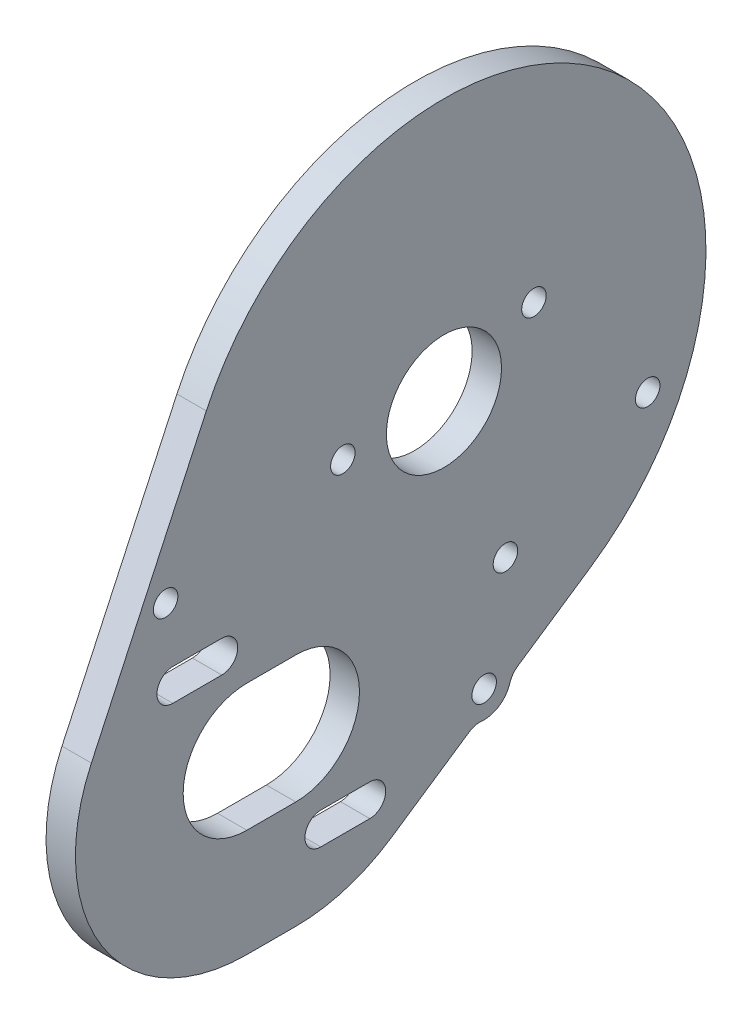
ISO-10303-21;
HEADER;
FILE_DESCRIPTION(('STEP AP214'),'2;1');
FILE_NAME('part.step','',(''),(''),'','','');
FILE_SCHEMA(('AUTOMOTIVE_DESIGN { 1 0 10303 214 1 1 1 1 }'));
ENDSEC;
DATA;
#1=APPLICATION_CONTEXT('core data for automotive mechanical design processes');
#2=APPLICATION_PROTOCOL_DEFINITION('international standard','automotive_design',2000,#1);
#3=PRODUCT_CONTEXT('',#1,'mechanical');
#4=PRODUCT('Part','Part','',(#3));
#5=PRODUCT_RELATED_PRODUCT_CATEGORY('part','',(#4));
#6=PRODUCT_DEFINITION_FORMATION('','',#4);
#7=PRODUCT_DEFINITION_CONTEXT('part definition',#1,'design');
#8=PRODUCT_DEFINITION('design','',#6,#7);
#9=PRODUCT_DEFINITION_SHAPE('','',#8);
#10=(LENGTH_UNIT() NAMED_UNIT(*) SI_UNIT(.MILLI.,.METRE.));
#11=(NAMED_UNIT(*) PLANE_ANGLE_UNIT() SI_UNIT($,.RADIAN.));
#12=(NAMED_UNIT(*) SI_UNIT($,.STERADIAN.) SOLID_ANGLE_UNIT());
#13=UNCERTAINTY_MEASURE_WITH_UNIT(LENGTH_MEASURE(1.E-05),#10,'distance_accuracy_value','');
#14=(GEOMETRIC_REPRESENTATION_CONTEXT(3) GLOBAL_UNCERTAINTY_ASSIGNED_CONTEXT((#13)) GLOBAL_UNIT_ASSIGNED_CONTEXT((#10,
#11,#12)) REPRESENTATION_CONTEXT('',''));
#15=CARTESIAN_POINT('',(0.,0.,0.));
#16=DIRECTION('',(0.,0.,1.));
#17=DIRECTION('',(1.,0.,0.));
#18=AXIS2_PLACEMENT_3D('',#15,#16,#17);
#19=CARTESIAN_POINT('',(3.,-11.25,22.6793840389092));
#20=DIRECTION('',(-1.,0.,0.));
#21=DIRECTION('',(0.,0.,1.));
#22=AXIS2_PLACEMENT_3D('',#19,#20,#21);
#23=CYLINDRICAL_SURFACE('',#22,1.625);
#24=CARTESIAN_POINT('',(0.,-11.25,22.6793840389092));
#25=DIRECTION('',(1.,0.,0.));
#26=DIRECTION('',(0.,0.,-1.));
#27=AXIS2_PLACEMENT_3D('',#24,#25,#26);
#28=CIRCLE('',#27,1.625);
#29=CARTESIAN_POINT('',(0.,-12.875,22.6793840389092));
#30=VERTEX_POINT('',#29);
#31=CARTESIAN_POINT('',(0.,-9.625,22.6793840389092));
#32=VERTEX_POINT('',#31);
#33=EDGE_CURVE('E285',#30,#32,#28,.T.);
#34=ORIENTED_EDGE('',*,*,#33,.F.);
#35=DIRECTION('',(-1.,0.,0.));
#36=VECTOR('',#35,1.);
#37=CARTESIAN_POINT('',(3.,-12.875,22.6793840389092));
#38=LINE('',#37,#36);
#39=CARTESIAN_POINT('',(3.,-12.875,22.6793840389092));
#40=VERTEX_POINT('',#39);
#41=EDGE_CURVE('E11',#40,#30,#38,.T.);
#42=ORIENTED_EDGE('',*,*,#41,.F.);
#43=CARTESIAN_POINT('',(3.,-11.25,22.6793840389092));
#44=DIRECTION('',(1.,0.,0.));
#45=DIRECTION('',(0.,0.,-1.));
#46=AXIS2_PLACEMENT_3D('',#43,#44,#45);
#47=CIRCLE('',#46,1.625);
#48=CARTESIAN_POINT('',(3.,-9.625,22.6793840389092));
#49=VERTEX_POINT('',#48);
#50=EDGE_CURVE('E207',#40,#49,#47,.T.);
#51=ORIENTED_EDGE('',*,*,#50,.T.);
#52=DIRECTION('',(-1.,0.,0.));
#53=VECTOR('',#52,1.);
#54=CARTESIAN_POINT('',(3.,-9.625,22.6793840389092));
#55=LINE('',#54,#53);
#56=EDGE_CURVE('E54',#49,#32,#55,.T.);
#57=ORIENTED_EDGE('',*,*,#56,.T.);
#58=EDGE_LOOP('',(#34,#42,#51,#57));
#59=FACE_BOUND('',#58,.T.);
#60=ADVANCED_FACE('F35',(#59),#23,.F.);
#61=CARTESIAN_POINT('',(3.,-12.875,0.));
#62=DIRECTION('',(0.,1.,0.));
#63=DIRECTION('',(0.,0.,1.));
#64=AXIS2_PLACEMENT_3D('',#61,#62,#63);
#65=PLANE('',#64);
#66=DIRECTION('',(0.,0.,-1.));
#67=VECTOR('',#66,1.);
#68=CARTESIAN_POINT('',(0.,-12.875,0.));
#69=LINE('',#68,#67);
#70=CARTESIAN_POINT('',(0.,-12.875,27.6793840389092));
#71=VERTEX_POINT('',#70);
#72=EDGE_CURVE('E195',#71,#30,#69,.T.);
#73=ORIENTED_EDGE('',*,*,#72,.F.);
#74=DIRECTION('',(-1.,0.,0.));
#75=VECTOR('',#74,1.);
#76=CARTESIAN_POINT('',(3.,-12.875,27.6793840389092));
#77=LINE('',#76,#75);
#78=CARTESIAN_POINT('',(3.,-12.875,27.6793840389092));
#79=VERTEX_POINT('',#78);
#80=EDGE_CURVE('E45',#79,#71,#77,.T.);
#81=ORIENTED_EDGE('',*,*,#80,.F.);
#82=DIRECTION('',(0.,0.,-1.));
#83=VECTOR('',#82,1.);
#84=CARTESIAN_POINT('',(3.,-12.875,0.));
#85=LINE('',#84,#83);
#86=EDGE_CURVE('E193',#79,#40,#85,.T.);
#87=ORIENTED_EDGE('',*,*,#86,.T.);
#88=ORIENTED_EDGE('',*,*,#41,.T.);
#89=EDGE_LOOP('',(#73,#81,#87,#88));
#90=FACE_BOUND('',#89,.T.);
#91=ADVANCED_FACE('F192',(#90),#65,.T.);
#92=CARTESIAN_POINT('',(3.,-11.25,27.6793840389092));
#93=DIRECTION('',(-1.,0.,0.));
#94=DIRECTION('',(0.,0.,1.));
#95=AXIS2_PLACEMENT_3D('',#92,#93,#94);
#96=CYLINDRICAL_SURFACE('',#95,1.625);
#97=CARTESIAN_POINT('',(0.,-11.25,27.6793840389092));
#98=DIRECTION('',(1.,0.,0.));
#99=DIRECTION('',(0.,0.,-1.));
#100=AXIS2_PLACEMENT_3D('',#97,#98,#99);
#101=CIRCLE('',#100,1.625);
#102=CARTESIAN_POINT('',(0.,-9.625,27.6793840389092));
#103=VERTEX_POINT('',#102);
#104=EDGE_CURVE('E288',#103,#71,#101,.T.);
#105=ORIENTED_EDGE('',*,*,#104,.F.);
#106=DIRECTION('',(-1.,0.,0.));
#107=VECTOR('',#106,1.);
#108=CARTESIAN_POINT('',(3.,-9.625,27.6793840389092));
#109=LINE('',#108,#107);
#110=CARTESIAN_POINT('',(3.,-9.625,27.6793840389092));
#111=VERTEX_POINT('',#110);
#112=EDGE_CURVE('E121',#111,#103,#109,.T.);
#113=ORIENTED_EDGE('',*,*,#112,.F.);
#114=CARTESIAN_POINT('',(3.,-11.25,27.6793840389092));
#115=DIRECTION('',(1.,0.,0.));
#116=DIRECTION('',(0.,0.,-1.));
#117=AXIS2_PLACEMENT_3D('',#114,#115,#116);
#118=CIRCLE('',#117,1.625);
#119=EDGE_CURVE('E206',#111,#79,#118,.T.);
#120=ORIENTED_EDGE('',*,*,#119,.T.);
#121=ORIENTED_EDGE('',*,*,#80,.T.);
#122=EDGE_LOOP('',(#105,#113,#120,#121));
#123=FACE_BOUND('',#122,.T.);
#124=ADVANCED_FACE('F209',(#123),#96,.F.);
#125=CARTESIAN_POINT('',(3.,-31.5,7.57061596109084));
#126=DIRECTION('',(-1.,0.,0.));
#127=DIRECTION('',(0.,0.,1.));
#128=AXIS2_PLACEMENT_3D('',#125,#126,#127);
#129=CYLINDRICAL_SURFACE('',#128,1.625);
#130=CARTESIAN_POINT('',(0.,-31.5,7.57061596109084));
#131=DIRECTION('',(1.,0.,0.));
#132=DIRECTION('',(0.,0.,-1.));
#133=AXIS2_PLACEMENT_3D('',#130,#131,#132);
#134=CIRCLE('',#133,1.625);
#135=CARTESIAN_POINT('',(0.,-33.125,7.57061596109084));
#136=VERTEX_POINT('',#135);
#137=CARTESIAN_POINT('',(0.,-29.875,7.57061596109084));
#138=VERTEX_POINT('',#137);
#139=EDGE_CURVE('E270',#136,#138,#134,.T.);
#140=ORIENTED_EDGE('',*,*,#139,.F.);
#141=DIRECTION('',(-1.,0.,0.));
#142=VECTOR('',#141,1.);
#143=CARTESIAN_POINT('',(3.,-33.125,7.57061596109084));
#144=LINE('',#143,#142);
#145=CARTESIAN_POINT('',(3.,-33.125,7.57061596109084));
#146=VERTEX_POINT('',#145);
#147=EDGE_CURVE('E310',#146,#136,#144,.T.);
#148=ORIENTED_EDGE('',*,*,#147,.F.);
#149=CARTESIAN_POINT('',(3.,-31.5,7.57061596109084));
#150=DIRECTION('',(1.,0.,0.));
#151=DIRECTION('',(0.,0.,-1.));
#152=AXIS2_PLACEMENT_3D('',#149,#150,#151);
#153=CIRCLE('',#152,1.625);
#154=CARTESIAN_POINT('',(3.,-29.875,7.57061596109084));
#155=VERTEX_POINT('',#154);
#156=EDGE_CURVE('E430',#146,#155,#153,.T.);
#157=ORIENTED_EDGE('',*,*,#156,.T.);
#158=DIRECTION('',(-1.,0.,0.));
#159=VECTOR('',#158,1.);
#160=CARTESIAN_POINT('',(3.,-29.875,7.57061596109084));
#161=LINE('',#160,#159);
#162=EDGE_CURVE('E312',#155,#138,#161,.T.);
#163=ORIENTED_EDGE('',*,*,#162,.T.);
#164=EDGE_LOOP('',(#140,#148,#157,#163));
#165=FACE_BOUND('',#164,.T.);
#166=ADVANCED_FACE('F479',(#165),#129,.F.);
#167=CARTESIAN_POINT('',(3.,-33.125,0.));
#168=DIRECTION('',(0.,1.,0.));
#169=DIRECTION('',(0.,0.,1.));
#170=AXIS2_PLACEMENT_3D('',#167,#168,#169);
#171=PLANE('',#170);
#172=DIRECTION('',(0.,0.,-1.));
#173=VECTOR('',#172,1.);
#174=CARTESIAN_POINT('',(0.,-33.125,0.));
#175=LINE('',#174,#173);
#176=CARTESIAN_POINT('',(0.,-33.125,12.5706159610908));
#177=VERTEX_POINT('',#176);
#178=EDGE_CURVE('E273',#177,#136,#175,.T.);
#179=ORIENTED_EDGE('',*,*,#178,.F.);
#180=DIRECTION('',(-1.,0.,0.));
#181=VECTOR('',#180,1.);
#182=CARTESIAN_POINT('',(3.,-33.125,12.5706159610908));
#183=LINE('',#182,#181);
#184=CARTESIAN_POINT('',(3.,-33.125,12.5706159610908));
#185=VERTEX_POINT('',#184);
#186=EDGE_CURVE('E317',#185,#177,#183,.T.);
#187=ORIENTED_EDGE('',*,*,#186,.F.);
#188=DIRECTION('',(0.,0.,-1.));
#189=VECTOR('',#188,1.);
#190=CARTESIAN_POINT('',(3.,-33.125,0.));
#191=LINE('',#190,#189);
#192=EDGE_CURVE('E433',#185,#146,#191,.T.);
#193=ORIENTED_EDGE('',*,*,#192,.T.);
#194=ORIENTED_EDGE('',*,*,#147,.T.);
#195=EDGE_LOOP('',(#179,#187,#193,#194));
#196=FACE_BOUND('',#195,.T.);
#197=ADVANCED_FACE('F475',(#196),#171,.T.);
#198=CARTESIAN_POINT('',(3.,-31.5,12.5706159610908));
#199=DIRECTION('',(-1.,0.,0.));
#200=DIRECTION('',(0.,0.,1.));
#201=AXIS2_PLACEMENT_3D('',#198,#199,#200);
#202=CYLINDRICAL_SURFACE('',#201,1.62500000000001);
#203=CARTESIAN_POINT('',(0.,-31.5,12.5706159610908));
#204=DIRECTION('',(1.,0.,0.));
#205=DIRECTION('',(0.,0.,-1.));
#206=AXIS2_PLACEMENT_3D('',#203,#204,#205);
#207=CIRCLE('',#206,1.62500000000001);
#208=CARTESIAN_POINT('',(0.,-29.875,12.5706159610908));
#209=VERTEX_POINT('',#208);
#210=EDGE_CURVE('E276',#209,#177,#207,.T.);
#211=ORIENTED_EDGE('',*,*,#210,.F.);
#212=DIRECTION('',(-1.,0.,0.));
#213=VECTOR('',#212,1.);
#214=CARTESIAN_POINT('',(3.,-29.875,12.5706159610908));
#215=LINE('',#214,#213);
#216=CARTESIAN_POINT('',(3.,-29.875,12.5706159610908));
#217=VERTEX_POINT('',#216);
#218=EDGE_CURVE('E314',#217,#209,#215,.T.);
#219=ORIENTED_EDGE('',*,*,#218,.F.);
#220=CARTESIAN_POINT('',(3.,-31.5,12.5706159610908));
#221=DIRECTION('',(1.,0.,0.));
#222=DIRECTION('',(0.,0.,-1.));
#223=AXIS2_PLACEMENT_3D('',#220,#221,#222);
#224=CIRCLE('',#223,1.62500000000001);
#225=EDGE_CURVE('E436',#217,#185,#224,.T.);
#226=ORIENTED_EDGE('',*,*,#225,.T.);
#227=ORIENTED_EDGE('',*,*,#186,.T.);
#228=EDGE_LOOP('',(#211,#219,#226,#227));
#229=FACE_BOUND('',#228,.T.);
#230=ADVANCED_FACE('F471',(#229),#202,.F.);
#231=CARTESIAN_POINT('',(3.,-21.375,20.125));
#232=DIRECTION('',(-1.,0.,0.));
#233=DIRECTION('',(0.,0.,1.));
#234=AXIS2_PLACEMENT_3D('',#231,#232,#233);
#235=CYLINDRICAL_SURFACE('',#234,6.5);
#236=CARTESIAN_POINT('',(0.,-21.375,20.125));
#237=DIRECTION('',(1.,0.,0.));
#238=DIRECTION('',(0.,0.,-1.));
#239=AXIS2_PLACEMENT_3D('',#236,#237,#238);
#240=CIRCLE('',#239,6.5);
#241=CARTESIAN_POINT('',(0.,-14.875,20.125));
#242=VERTEX_POINT('',#241);
#243=CARTESIAN_POINT('',(0.,-27.875,20.125));
#244=VERTEX_POINT('',#243);
#245=EDGE_CURVE('E258',#242,#244,#240,.T.);
#246=ORIENTED_EDGE('',*,*,#245,.F.);
#247=DIRECTION('',(-1.,0.,0.));
#248=VECTOR('',#247,1.);
#249=CARTESIAN_POINT('',(3.,-14.875,20.125));
#250=LINE('',#249,#248);
#251=CARTESIAN_POINT('',(3.,-14.875,20.125));
#252=VERTEX_POINT('',#251);
#253=EDGE_CURVE('E315',#252,#242,#250,.T.);
#254=ORIENTED_EDGE('',*,*,#253,.F.);
#255=CARTESIAN_POINT('',(3.,-21.375,20.125));
#256=DIRECTION('',(1.,0.,0.));
#257=DIRECTION('',(0.,0.,-1.));
#258=AXIS2_PLACEMENT_3D('',#255,#256,#257);
#259=CIRCLE('',#258,6.5);
#260=CARTESIAN_POINT('',(3.,-27.875,20.125));
#261=VERTEX_POINT('',#260);
#262=EDGE_CURVE('E420',#252,#261,#259,.T.);
#263=ORIENTED_EDGE('',*,*,#262,.T.);
#264=DIRECTION('',(-1.,0.,0.));
#265=VECTOR('',#264,1.);
#266=CARTESIAN_POINT('',(3.,-27.875,20.125));
#267=LINE('',#266,#265);
#268=EDGE_CURVE('E320',#261,#244,#267,.T.);
#269=ORIENTED_EDGE('',*,*,#268,.T.);
#270=EDGE_LOOP('',(#246,#254,#263,#269));
#271=FACE_BOUND('',#270,.T.);
#272=ADVANCED_FACE('F474',(#271),#235,.F.);
#273=CARTESIAN_POINT('',(3.,-14.875,0.));
#274=DIRECTION('',(0.,1.,0.));
#275=DIRECTION('',(0.,0.,1.));
#276=AXIS2_PLACEMENT_3D('',#273,#274,#275);
#277=PLANE('',#276);
#278=DIRECTION('',(0.,0.,-1.));
#279=VECTOR('',#278,1.);
#280=CARTESIAN_POINT('',(0.,-14.875,0.));
#281=LINE('',#280,#279);
#282=CARTESIAN_POINT('',(0.,-14.875,15.125));
#283=VERTEX_POINT('',#282);
#284=EDGE_CURVE('E261',#242,#283,#281,.T.);
#285=ORIENTED_EDGE('',*,*,#284,.T.);
#286=DIRECTION('',(-1.,0.,0.));
#287=VECTOR('',#286,1.);
#288=CARTESIAN_POINT('',(3.,-14.875,15.125));
#289=LINE('',#288,#287);
#290=CARTESIAN_POINT('',(3.,-14.875,15.125));
#291=VERTEX_POINT('',#290);
#292=EDGE_CURVE('E324',#291,#283,#289,.T.);
#293=ORIENTED_EDGE('',*,*,#292,.F.);
#294=DIRECTION('',(0.,0.,-1.));
#295=VECTOR('',#294,1.);
#296=CARTESIAN_POINT('',(3.,-14.875,0.));
#297=LINE('',#296,#295);
#298=EDGE_CURVE('E423',#252,#291,#297,.T.);
#299=ORIENTED_EDGE('',*,*,#298,.F.);
#300=ORIENTED_EDGE('',*,*,#253,.T.);
#301=EDGE_LOOP('',(#285,#293,#299,#300));
#302=FACE_BOUND('',#301,.T.);
#303=ADVANCED_FACE('F491',(#302),#277,.F.);
#304=CARTESIAN_POINT('',(3.,-21.375,15.125));
#305=DIRECTION('',(-1.,0.,0.));
#306=DIRECTION('',(0.,0.,1.));
#307=AXIS2_PLACEMENT_3D('',#304,#305,#306);
#308=CYLINDRICAL_SURFACE('',#307,6.5);
#309=CARTESIAN_POINT('',(0.,-21.375,15.125));
#310=DIRECTION('',(1.,0.,0.));
#311=DIRECTION('',(0.,0.,-1.));
#312=AXIS2_PLACEMENT_3D('',#309,#310,#311);
#313=CIRCLE('',#312,6.5);
#314=CARTESIAN_POINT('',(0.,-27.875,15.125));
#315=VERTEX_POINT('',#314);
#316=EDGE_CURVE('E264',#315,#283,#313,.T.);
#317=ORIENTED_EDGE('',*,*,#316,.F.);
#318=DIRECTION('',(-1.,0.,0.));
#319=VECTOR('',#318,1.);
#320=CARTESIAN_POINT('',(3.,-27.875,15.125));
#321=LINE('',#320,#319);
#322=CARTESIAN_POINT('',(3.,-27.875,15.125));
#323=VERTEX_POINT('',#322);
#324=EDGE_CURVE('E322',#323,#315,#321,.T.);
#325=ORIENTED_EDGE('',*,*,#324,.F.);
#326=CARTESIAN_POINT('',(3.,-21.375,15.125));
#327=DIRECTION('',(1.,0.,0.));
#328=DIRECTION('',(0.,0.,-1.));
#329=AXIS2_PLACEMENT_3D('',#326,#327,#328);
#330=CIRCLE('',#329,6.5);
#331=EDGE_CURVE('E425',#323,#291,#330,.T.);
#332=ORIENTED_EDGE('',*,*,#331,.T.);
#333=ORIENTED_EDGE('',*,*,#292,.T.);
#334=EDGE_LOOP('',(#317,#325,#332,#333));
#335=FACE_BOUND('',#334,.T.);
#336=ADVANCED_FACE('F488',(#335),#308,.F.);
#337=CARTESIAN_POINT('',(3.,-22.1688830151957,-14.970074343789));
#338=DIRECTION('',(0.,-0.828743290287689,-0.559628947431363));
#339=DIRECTION('',(0.,0.559628947431363,-0.828743290287689));
#340=AXIS2_PLACEMENT_3D('',#337,#338,#339);
#341=PLANE('',#340);
#342=DIRECTION('',(0.,-0.559628947431363,0.828743290287689));
#343=VECTOR('',#342,1.);
#344=CARTESIAN_POINT('',(0.,-22.1688830151957,-14.970074343789));
#345=LINE('',#344,#343);
#346=CARTESIAN_POINT('',(0.,-22.1688830151957,-14.970074343789));
#347=VERTEX_POINT('',#346);
#348=CARTESIAN_POINT('',(0.,-27.1900133476632,-7.53438308480016));
#349=VERTEX_POINT('',#348);
#350=EDGE_CURVE('E231',#347,#349,#345,.T.);
#351=ORIENTED_EDGE('',*,*,#350,.F.);
#352=DIRECTION('',(-1.,0.,0.));
#353=VECTOR('',#352,1.);
#354=CARTESIAN_POINT('',(3.,-22.1688830151957,-14.970074343789));
#355=LINE('',#354,#353);
#356=CARTESIAN_POINT('',(3.,-22.1688830151957,-14.970074343789));
#357=VERTEX_POINT('',#356);
#358=EDGE_CURVE('E39',#357,#347,#355,.T.);
#359=ORIENTED_EDGE('',*,*,#358,.F.);
#360=DIRECTION('',(0.,-0.559628947431363,0.828743290287689));
#361=VECTOR('',#360,1.);
#362=CARTESIAN_POINT('',(3.,-22.1688830151957,-14.970074343789));
#363=LINE('',#362,#361);
#364=CARTESIAN_POINT('',(3.,-27.1900133476632,-7.53438308480016));
#365=VERTEX_POINT('',#364);
#366=EDGE_CURVE('E308',#357,#365,#363,.T.);
#367=ORIENTED_EDGE('',*,*,#366,.T.);
#368=DIRECTION('',(-1.,0.,0.));
#369=VECTOR('',#368,1.);
#370=CARTESIAN_POINT('',(3.,-27.1900133476632,-7.53438308480016));
#371=LINE('',#370,#369);
#372=EDGE_CURVE('E230',#365,#349,#371,.T.);
#373=ORIENTED_EDGE('',*,*,#372,.T.);
#374=EDGE_LOOP('',(#351,#359,#367,#373));
#375=FACE_BOUND('',#374,.T.);
#376=ADVANCED_FACE('F37',(#375),#341,.T.);
#377=CARTESIAN_POINT('',(3.,0.,0.));
#378=DIRECTION('',(-1.,0.,0.));
#379=DIRECTION('',(0.,0.,1.));
#380=AXIS2_PLACEMENT_3D('',#377,#378,#379);
#381=CYLINDRICAL_SURFACE('',#380,26.75);
#382=CARTESIAN_POINT('',(0.,0.,0.));
#383=DIRECTION('',(1.,0.,0.));
#384=DIRECTION('',(0.,0.,-1.));
#385=AXIS2_PLACEMENT_3D('',#382,#383,#384);
#386=CIRCLE('',#385,26.75);
#387=CARTESIAN_POINT('',(0.,11.266731362633,24.2615593975792));
#388=VERTEX_POINT('',#387);
#389=EDGE_CURVE('E234',#347,#388,#386,.T.);
#390=ORIENTED_EDGE('',*,*,#389,.T.);
#391=DIRECTION('',(-1.,0.,0.));
#392=VECTOR('',#391,1.);
#393=CARTESIAN_POINT('',(3.,11.266731362633,24.2615593975792));
#394=LINE('',#393,#392);
#395=CARTESIAN_POINT('',(3.,11.266731362633,24.2615593975792));
#396=VERTEX_POINT('',#395);
#397=EDGE_CURVE('E346',#396,#388,#394,.T.);
#398=ORIENTED_EDGE('',*,*,#397,.F.);
#399=CARTESIAN_POINT('',(3.,0.,0.));
#400=DIRECTION('',(1.,0.,0.));
#401=DIRECTION('',(0.,0.,-1.));
#402=AXIS2_PLACEMENT_3D('',#399,#400,#401);
#403=CIRCLE('',#402,26.75);
#404=EDGE_CURVE('E355',#357,#396,#403,.T.);
#405=ORIENTED_EDGE('',*,*,#404,.F.);
#406=ORIENTED_EDGE('',*,*,#358,.T.);
#407=EDGE_LOOP('',(#390,#398,#405,#406));
#408=FACE_BOUND('',#407,.T.);
#409=ADVANCED_FACE('F354',(#408),#381,.T.);
#410=CARTESIAN_POINT('',(3.,11.266731362633,24.2615593975792));
#411=DIRECTION('',(0.,-0.421186219163851,-0.906974183087072));
#412=DIRECTION('',(0.,0.906974183087072,-0.421186219163851));
#413=AXIS2_PLACEMENT_3D('',#410,#411,#412);
#414=PLANE('',#413);
#415=DIRECTION('',(0.,-0.906974183087072,0.421186219163851));
#416=VECTOR('',#415,1.);
#417=CARTESIAN_POINT('',(0.,11.266731362633,24.2615593975792));
#418=LINE('',#417,#416);
#419=CARTESIAN_POINT('',(0.,-14.0042411646326,35.9970482040238));
#420=VERTEX_POINT('',#419);
#421=EDGE_CURVE('E236',#388,#420,#418,.T.);
#422=ORIENTED_EDGE('',*,*,#421,.T.);
#423=DIRECTION('',(-1.,0.,0.));
#424=VECTOR('',#423,1.);
#425=CARTESIAN_POINT('',(3.,-14.0042411646326,35.9970482040238));
#426=LINE('',#425,#424);
#427=CARTESIAN_POINT('',(3.,-14.0042411646326,35.9970482040238));
#428=VERTEX_POINT('',#427);
#429=EDGE_CURVE('E344',#428,#420,#426,.T.);
#430=ORIENTED_EDGE('',*,*,#429,.F.);
#431=DIRECTION('',(0.,-0.906974183087072,0.421186219163851));
#432=VECTOR('',#431,1.);
#433=CARTESIAN_POINT('',(3.,11.266731362633,24.2615593975792));
#434=LINE('',#433,#432);
#435=EDGE_CURVE('E403',#396,#428,#434,.T.);
#436=ORIENTED_EDGE('',*,*,#435,.F.);
#437=ORIENTED_EDGE('',*,*,#397,.T.);
#438=EDGE_LOOP('',(#422,#430,#436,#437));
#439=FACE_BOUND('',#438,.T.);
#440=ADVANCED_FACE('F402',(#439),#414,.F.);
#441=CARTESIAN_POINT('',(3.,-21.375,20.125));
#442=DIRECTION('',(-1.,0.,0.));
#443=DIRECTION('',(0.,0.,1.));
#444=AXIS2_PLACEMENT_3D('',#441,#442,#443);
#445=CYLINDRICAL_SURFACE('',#444,17.5);
#446=CARTESIAN_POINT('',(0.,-21.375,20.125));
#447=DIRECTION('',(1.,0.,0.));
#448=DIRECTION('',(0.,0.,-1.));
#449=AXIS2_PLACEMENT_3D('',#446,#447,#448);
#450=CIRCLE('',#449,17.5);
#451=CARTESIAN_POINT('',(0.,-38.875,20.125));
#452=VERTEX_POINT('',#451);
#453=EDGE_CURVE('E238',#420,#452,#450,.T.);
#454=ORIENTED_EDGE('',*,*,#453,.T.);
#455=DIRECTION('',(-1.,0.,0.));
#456=VECTOR('',#455,1.);
#457=CARTESIAN_POINT('',(3.,-38.875,20.125));
#458=LINE('',#457,#456);
#459=CARTESIAN_POINT('',(3.,-38.875,20.125));
#460=VERTEX_POINT('',#459);
#461=EDGE_CURVE('E341',#460,#452,#458,.T.);
#462=ORIENTED_EDGE('',*,*,#461,.F.);
#463=CARTESIAN_POINT('',(3.,-21.375,20.125));
#464=DIRECTION('',(1.,0.,0.));
#465=DIRECTION('',(0.,0.,-1.));
#466=AXIS2_PLACEMENT_3D('',#463,#464,#465);
#467=CIRCLE('',#466,17.5);
#468=EDGE_CURVE('E400',#428,#460,#467,.T.);
#469=ORIENTED_EDGE('',*,*,#468,.F.);
#470=ORIENTED_EDGE('',*,*,#429,.T.);
#471=EDGE_LOOP('',(#454,#462,#469,#470));
#472=FACE_BOUND('',#471,.T.);
#473=ADVANCED_FACE('F399',(#472),#445,.T.);
#474=CARTESIAN_POINT('',(3.,-38.875,0.));
#475=DIRECTION('',(0.,1.,0.));
#476=DIRECTION('',(0.,0.,1.));
#477=AXIS2_PLACEMENT_3D('',#474,#475,#476);
#478=PLANE('',#477);
#479=DIRECTION('',(0.,0.,-1.));
#480=VECTOR('',#479,1.);
#481=CARTESIAN_POINT('',(0.,-38.875,0.));
#482=LINE('',#481,#480);
#483=CARTESIAN_POINT('',(0.,-38.875,15.125));
#484=VERTEX_POINT('',#483);
#485=EDGE_CURVE('E240',#452,#484,#482,.T.);
#486=ORIENTED_EDGE('',*,*,#485,.T.);
#487=DIRECTION('',(-1.,0.,0.));
#488=VECTOR('',#487,1.);
#489=CARTESIAN_POINT('',(3.,-38.875,15.125));
#490=LINE('',#489,#488);
#491=CARTESIAN_POINT('',(3.,-38.875,15.125));
#492=VERTEX_POINT('',#491);
#493=EDGE_CURVE('E338',#492,#484,#490,.T.);
#494=ORIENTED_EDGE('',*,*,#493,.F.);
#495=DIRECTION('',(0.,0.,-1.));
#496=VECTOR('',#495,1.);
#497=CARTESIAN_POINT('',(3.,-38.875,0.));
#498=LINE('',#497,#496);
#499=EDGE_CURVE('E395',#460,#492,#498,.T.);
#500=ORIENTED_EDGE('',*,*,#499,.F.);
#501=ORIENTED_EDGE('',*,*,#461,.T.);
#502=EDGE_LOOP('',(#486,#494,#500,#501));
#503=FACE_BOUND('',#502,.T.);
#504=ADVANCED_FACE('F394',(#503),#478,.F.);
#505=CARTESIAN_POINT('',(3.,-21.375,15.125));
#506=DIRECTION('',(-1.,0.,0.));
#507=DIRECTION('',(0.,0.,1.));
#508=AXIS2_PLACEMENT_3D('',#505,#506,#507);
#509=CYLINDRICAL_SURFACE('',#508,17.5);
#510=CARTESIAN_POINT('',(0.,-21.375,15.125));
#511=DIRECTION('',(1.,0.,0.));
#512=DIRECTION('',(0.,0.,-1.));
#513=AXIS2_PLACEMENT_3D('',#510,#511,#512);
#514=CIRCLE('',#513,17.5);
#515=CARTESIAN_POINT('',(0.,-35.8780075800345,5.33149341995113));
#516=VERTEX_POINT('',#515);
#517=EDGE_CURVE('E242',#484,#516,#514,.T.);
#518=ORIENTED_EDGE('',*,*,#517,.T.);
#519=DIRECTION('',(-1.,0.,0.));
#520=VECTOR('',#519,1.);
#521=CARTESIAN_POINT('',(3.,-35.8780075800345,5.33149341995113));
#522=LINE('',#521,#520);
#523=CARTESIAN_POINT('',(3.,-35.8780075800345,5.33149341995113));
#524=VERTEX_POINT('',#523);
#525=EDGE_CURVE('E336',#524,#516,#522,.T.);
#526=ORIENTED_EDGE('',*,*,#525,.F.);
#527=CARTESIAN_POINT('',(3.,-21.375,15.125));
#528=DIRECTION('',(1.,0.,0.));
#529=DIRECTION('',(0.,0.,-1.));
#530=AXIS2_PLACEMENT_3D('',#527,#528,#529);
#531=CIRCLE('',#530,17.5);
#532=EDGE_CURVE('E391',#492,#524,#531,.T.);
#533=ORIENTED_EDGE('',*,*,#532,.F.);
#534=ORIENTED_EDGE('',*,*,#493,.T.);
#535=EDGE_LOOP('',(#518,#526,#533,#534));
#536=FACE_BOUND('',#535,.T.);
#537=ADVANCED_FACE('F388',(#536),#509,.T.);
#538=CARTESIAN_POINT('',(3.,-22.1688830151957,-14.970074343789));
#539=DIRECTION('',(0.,-0.828743290287689,-0.559628947431363));
#540=DIRECTION('',(0.,0.559628947431363,-0.828743290287689));
#541=AXIS2_PLACEMENT_3D('',#538,#539,#540);
#542=PLANE('',#541);
#543=DIRECTION('',(0.,-0.559628947431363,0.828743290287689));
#544=VECTOR('',#543,1.);
#545=CARTESIAN_POINT('',(0.,-22.1688830151957,-14.970074343789));
#546=LINE('',#545,#544);
#547=CARTESIAN_POINT('',(0.,-30.5542252851418,-2.55238906342571));
#548=VERTEX_POINT('',#547);
#549=EDGE_CURVE('E245',#548,#516,#546,.T.);
#550=ORIENTED_EDGE('',*,*,#549,.F.);
#551=DIRECTION('',(-1.,0.,0.));
#552=VECTOR('',#551,1.);
#553=CARTESIAN_POINT('',(3.,-30.5542252851418,-2.55238906342571));
#554=LINE('',#553,#552);
#555=CARTESIAN_POINT('',(3.,-30.5542252851418,-2.55238906342571));
#556=VERTEX_POINT('',#555);
#557=EDGE_CURVE('E334',#556,#548,#554,.T.);
#558=ORIENTED_EDGE('',*,*,#557,.F.);
#559=DIRECTION('',(0.,-0.559628947431363,0.828743290287689));
#560=VECTOR('',#559,1.);
#561=CARTESIAN_POINT('',(3.,-22.1688830151957,-14.970074343789));
#562=LINE('',#561,#560);
#563=EDGE_CURVE('E383',#556,#524,#562,.T.);
#564=ORIENTED_EDGE('',*,*,#563,.T.);
#565=ORIENTED_EDGE('',*,*,#525,.T.);
#566=EDGE_LOOP('',(#550,#558,#564,#565));
#567=FACE_BOUND('',#566,.T.);
#568=ADVANCED_FACE('F382',(#567),#542,.T.);
#569=CARTESIAN_POINT('',(3.,-32.2117118657172,-3.67164695828844));
#570=DIRECTION('',(-1.,0.,0.));
#571=DIRECTION('',(0.,0.,1.));
#572=AXIS2_PLACEMENT_3D('',#569,#570,#571);
#573=CYLINDRICAL_SURFACE('',#572,2.);
#574=CARTESIAN_POINT('',(0.,-32.2117118657172,-3.67164695828844));
#575=DIRECTION('',(1.,0.,0.));
#576=DIRECTION('',(0.,0.,-1.));
#577=AXIS2_PLACEMENT_3D('',#574,#575,#576);
#578=CIRCLE('',#577,2.);
#579=CARTESIAN_POINT('',(0.,-30.2200259112877,-3.85382011473044));
#580=VERTEX_POINT('',#579);
#581=EDGE_CURVE('E248',#548,#580,#578,.F.);
#582=ORIENTED_EDGE('',*,*,#581,.T.);
#583=DIRECTION('',(-1.,0.,0.));
#584=VECTOR('',#583,1.);
#585=CARTESIAN_POINT('',(3.,-30.2200259112877,-3.85382011473044));
#586=LINE('',#585,#584);
#587=CARTESIAN_POINT('',(3.,-30.2200259112877,-3.85382011473044));
#588=VERTEX_POINT('',#587);
#589=EDGE_CURVE('E331',#588,#580,#586,.T.);
#590=ORIENTED_EDGE('',*,*,#589,.F.);
#591=CARTESIAN_POINT('',(3.,-32.2117118657172,-3.67164695828844));
#592=DIRECTION('',(1.,0.,0.));
#593=DIRECTION('',(0.,0.,-1.));
#594=AXIS2_PLACEMENT_3D('',#591,#592,#593);
#595=CIRCLE('',#594,2.);
#596=EDGE_CURVE('E378',#556,#588,#595,.F.);
#597=ORIENTED_EDGE('',*,*,#596,.F.);
#598=ORIENTED_EDGE('',*,*,#557,.T.);
#599=EDGE_LOOP('',(#582,#590,#597,#598));
#600=FACE_BOUND('',#599,.T.);
#601=ADVANCED_FACE('F377',(#600),#573,.F.);
#602=CARTESIAN_POINT('',(3.,-27.481457723947,-4.10430820483819));
#603=DIRECTION('',(-1.,0.,0.));
#604=DIRECTION('',(0.,0.,1.));
#605=AXIS2_PLACEMENT_3D('',#602,#603,#604);
#606=CYLINDRICAL_SURFACE('',#605,2.75);
#607=CARTESIAN_POINT('',(0.,-27.481457723947,-4.10430820483819));
#608=DIRECTION('',(1.,0.,0.));
#609=DIRECTION('',(0.,0.,-1.));
#610=AXIS2_PLACEMENT_3D('',#607,#608,#609);
#611=CIRCLE('',#610,2.75);
#612=CARTESIAN_POINT('',(0.,-28.2723242632737,-6.7381324428946));
#613=VERTEX_POINT('',#612);
#614=EDGE_CURVE('E250',#580,#613,#611,.T.);
#615=ORIENTED_EDGE('',*,*,#614,.T.);
#616=DIRECTION('',(-1.,0.,0.));
#617=VECTOR('',#616,1.);
#618=CARTESIAN_POINT('',(3.,-28.2723242632737,-6.7381324428946));
#619=LINE('',#618,#617);
#620=CARTESIAN_POINT('',(3.,-28.2723242632737,-6.7381324428946));
#621=VERTEX_POINT('',#620);
#622=EDGE_CURVE('E328',#621,#613,#619,.T.);
#623=ORIENTED_EDGE('',*,*,#622,.F.);
#624=CARTESIAN_POINT('',(3.,-27.481457723947,-4.10430820483819));
#625=DIRECTION('',(1.,0.,0.));
#626=DIRECTION('',(0.,0.,-1.));
#627=AXIS2_PLACEMENT_3D('',#624,#625,#626);
#628=CIRCLE('',#627,2.75);
#629=EDGE_CURVE('E374',#588,#621,#628,.T.);
#630=ORIENTED_EDGE('',*,*,#629,.F.);
#631=ORIENTED_EDGE('',*,*,#589,.T.);
#632=EDGE_LOOP('',(#615,#623,#630,#631));
#633=FACE_BOUND('',#632,.T.);
#634=ADVANCED_FACE('F371',(#633),#606,.T.);
#635=CARTESIAN_POINT('',(3.,0.,10.3226171376868));
#636=DIRECTION('',(-1.,0.,0.));
#637=DIRECTION('',(0.,0.,1.));
#638=AXIS2_PLACEMENT_3D('',#635,#636,#637);
#639=CYLINDRICAL_SURFACE('',#638,1.25);
#640=CARTESIAN_POINT('',(3.,0.,10.3226171376868));
#641=DIRECTION('',(1.,0.,0.));
#642=DIRECTION('',(0.,0.,-1.));
#643=AXIS2_PLACEMENT_3D('',#640,#641,#642);
#644=CIRCLE('',#643,1.25);
#645=CARTESIAN_POINT('',(3.,0.,9.07261713768683));
#646=VERTEX_POINT('',#645);
#647=EDGE_CURVE('E224',#646,#646,#644,.T.);
#648=ORIENTED_EDGE('',*,*,#647,.T.);
#649=EDGE_LOOP('',(#648));
#650=FACE_BOUND('',#649,.T.);
#651=CARTESIAN_POINT('',(0.,0.,10.3226171376868));
#652=DIRECTION('',(1.,0.,0.));
#653=DIRECTION('',(0.,0.,-1.));
#654=AXIS2_PLACEMENT_3D('',#651,#652,#653);
#655=CIRCLE('',#654,1.25);
#656=CARTESIAN_POINT('',(0.,0.,9.07261713768683));
#657=VERTEX_POINT('',#656);
#658=EDGE_CURVE('E302',#657,#657,#655,.T.);
#659=ORIENTED_EDGE('',*,*,#658,.F.);
#660=EDGE_LOOP('',(#659));
#661=FACE_BOUND('',#660,.T.);
#662=ADVANCED_FACE('F507',(#650,#661),#639,.F.);
#663=CARTESIAN_POINT('',(3.,4.1400622958964,-9.18950515177866));
#664=DIRECTION('',(-1.,0.,0.));
#665=DIRECTION('',(0.,0.,1.));
#666=AXIS2_PLACEMENT_3D('',#663,#664,#665);
#667=CYLINDRICAL_SURFACE('',#666,1.25);
#668=CARTESIAN_POINT('',(3.,4.1400622958964,-9.18950515177866));
#669=DIRECTION('',(1.,0.,0.));
#670=DIRECTION('',(0.,0.,-1.));
#671=AXIS2_PLACEMENT_3D('',#668,#669,#670);
#672=CIRCLE('',#671,1.25);
#673=CARTESIAN_POINT('',(3.,4.1400622958964,-10.4395051517787));
#674=VERTEX_POINT('',#673);
#675=EDGE_CURVE('E221',#674,#674,#672,.T.);
#676=ORIENTED_EDGE('',*,*,#675,.T.);
#677=EDGE_LOOP('',(#676));
#678=FACE_BOUND('',#677,.T.);
#679=CARTESIAN_POINT('',(0.,4.1400622958964,-9.18950515177866));
#680=DIRECTION('',(1.,0.,0.));
#681=DIRECTION('',(0.,0.,-1.));
#682=AXIS2_PLACEMENT_3D('',#679,#680,#681);
#683=CIRCLE('',#682,1.25);
#684=CARTESIAN_POINT('',(0.,4.1400622958964,-10.4395051517787));
#685=VERTEX_POINT('',#684);
#686=EDGE_CURVE('E299',#685,#685,#683,.T.);
#687=ORIENTED_EDGE('',*,*,#686,.F.);
#688=EDGE_LOOP('',(#687));
#689=FACE_BOUND('',#688,.T.);
#690=ADVANCED_FACE('F627',(#678,#689),#667,.F.);
#691=CARTESIAN_POINT('',(3.,-9.625,-20.8004750902304));
#692=DIRECTION('',(-1.,0.,0.));
#693=DIRECTION('',(0.,0.,1.));
#694=AXIS2_PLACEMENT_3D('',#691,#692,#693);
#695=CYLINDRICAL_SURFACE('',#694,1.25);
#696=CARTESIAN_POINT('',(3.,-9.625,-20.8004750902304));
#697=DIRECTION('',(1.,0.,0.));
#698=DIRECTION('',(0.,0.,-1.));
#699=AXIS2_PLACEMENT_3D('',#696,#697,#698);
#700=CIRCLE('',#699,1.25);
#701=CARTESIAN_POINT('',(3.,-9.625,-22.0504750902304));
#702=VERTEX_POINT('',#701);
#703=EDGE_CURVE('E218',#702,#702,#700,.T.);
#704=ORIENTED_EDGE('',*,*,#703,.T.);
#705=EDGE_LOOP('',(#704));
#706=FACE_BOUND('',#705,.T.);
#707=CARTESIAN_POINT('',(0.,-9.625,-20.8004750902304));
#708=DIRECTION('',(1.,0.,0.));
#709=DIRECTION('',(0.,0.,-1.));
#710=AXIS2_PLACEMENT_3D('',#707,#708,#709);
#711=CIRCLE('',#710,1.25);
#712=CARTESIAN_POINT('',(0.,-9.625,-22.0504750902304));
#713=VERTEX_POINT('',#712);
#714=EDGE_CURVE('E296',#713,#713,#711,.T.);
#715=ORIENTED_EDGE('',*,*,#714,.F.);
#716=EDGE_LOOP('',(#715));
#717=FACE_BOUND('',#716,.T.);
#718=ADVANCED_FACE('F456',(#706,#717),#695,.F.);
#719=CARTESIAN_POINT('',(3.,-16.9583305614494,-6.27761086361903));
#720=DIRECTION('',(-1.,0.,0.));
#721=DIRECTION('',(0.,0.,1.));
#722=AXIS2_PLACEMENT_3D('',#719,#720,#721);
#723=CYLINDRICAL_SURFACE('',#722,1.25);
#724=CARTESIAN_POINT('',(3.,-16.9583305614494,-6.27761086361903));
#725=DIRECTION('',(1.,0.,0.));
#726=DIRECTION('',(0.,0.,-1.));
#727=AXIS2_PLACEMENT_3D('',#724,#725,#726);
#728=CIRCLE('',#727,1.25);
#729=CARTESIAN_POINT('',(3.,-16.9583305614494,-7.52761086361903));
#730=VERTEX_POINT('',#729);
#731=EDGE_CURVE('E212',#730,#730,#728,.T.);
#732=ORIENTED_EDGE('',*,*,#731,.T.);
#733=EDGE_LOOP('',(#732));
#734=FACE_BOUND('',#733,.T.);
#735=CARTESIAN_POINT('',(0.,-16.9583305614494,-6.27761086361903));
#736=DIRECTION('',(1.,0.,0.));
#737=DIRECTION('',(0.,0.,-1.));
#738=AXIS2_PLACEMENT_3D('',#735,#736,#737);
#739=CIRCLE('',#738,1.25);
#740=CARTESIAN_POINT('',(0.,-16.9583305614494,-7.52761086361903));
#741=VERTEX_POINT('',#740);
#742=EDGE_CURVE('E293',#741,#741,#739,.T.);
#743=ORIENTED_EDGE('',*,*,#742,.F.);
#744=EDGE_LOOP('',(#743));
#745=FACE_BOUND('',#744,.T.);
#746=ADVANCED_FACE('F447',(#734,#745),#723,.F.);
#747=CARTESIAN_POINT('',(3.,-9.625,0.));
#748=DIRECTION('',(0.,-1.,0.));
#749=DIRECTION('',(0.,0.,-1.));
#750=AXIS2_PLACEMENT_3D('',#747,#748,#749);
#751=PLANE('',#750);
#752=DIRECTION('',(0.,0.,1.));
#753=VECTOR('',#752,1.);
#754=CARTESIAN_POINT('',(0.,-9.625,0.));
#755=LINE('',#754,#753);
#756=EDGE_CURVE('E290',#32,#103,#755,.T.);
#757=ORIENTED_EDGE('',*,*,#756,.F.);
#758=ORIENTED_EDGE('',*,*,#56,.F.);
#759=DIRECTION('',(0.,0.,1.));
#760=VECTOR('',#759,1.);
#761=CARTESIAN_POINT('',(3.,-9.625,0.));
#762=LINE('',#761,#760);
#763=EDGE_CURVE('E210',#49,#111,#762,.T.);
#764=ORIENTED_EDGE('',*,*,#763,.T.);
#765=ORIENTED_EDGE('',*,*,#112,.T.);
#766=EDGE_LOOP('',(#757,#758,#764,#765));
#767=FACE_BOUND('',#766,.T.);
#768=ADVANCED_FACE('F444',(#767),#751,.T.);
#769=CARTESIAN_POINT('',(3.,-3.65578568392269,28.4180163301151));
#770=DIRECTION('',(-1.,0.,0.));
#771=DIRECTION('',(0.,0.,1.));
#772=AXIS2_PLACEMENT_3D('',#769,#770,#771);
#773=CYLINDRICAL_SURFACE('',#772,1.25);
#774=CARTESIAN_POINT('',(3.,-3.65578568392269,28.4180163301151));
#775=DIRECTION('',(1.,0.,0.));
#776=DIRECTION('',(0.,0.,-1.));
#777=AXIS2_PLACEMENT_3D('',#774,#775,#776);
#778=CIRCLE('',#777,1.25);
#779=CARTESIAN_POINT('',(3.,-3.65578568392269,27.1680163301151));
#780=VERTEX_POINT('',#779);
#781=EDGE_CURVE('E442',#780,#780,#778,.T.);
#782=ORIENTED_EDGE('',*,*,#781,.T.);
#783=EDGE_LOOP('',(#782));
#784=FACE_BOUND('',#783,.T.);
#785=CARTESIAN_POINT('',(0.,-3.65578568392269,28.4180163301151));
#786=DIRECTION('',(1.,0.,0.));
#787=DIRECTION('',(0.,0.,-1.));
#788=AXIS2_PLACEMENT_3D('',#785,#786,#787);
#789=CIRCLE('',#788,1.25);
#790=CARTESIAN_POINT('',(0.,-3.65578568392269,27.1680163301151));
#791=VERTEX_POINT('',#790);
#792=EDGE_CURVE('E282',#791,#791,#789,.T.);
#793=ORIENTED_EDGE('',*,*,#792,.F.);
#794=EDGE_LOOP('',(#793));
#795=FACE_BOUND('',#794,.T.);
#796=ADVANCED_FACE('F446',(#784,#795),#773,.F.);
#797=CARTESIAN_POINT('',(3.,-29.875,0.));
#798=DIRECTION('',(0.,-1.,0.));
#799=DIRECTION('',(0.,0.,-1.));
#800=AXIS2_PLACEMENT_3D('',#797,#798,#799);
#801=PLANE('',#800);
#802=DIRECTION('',(0.,0.,1.));
#803=VECTOR('',#802,1.);
#804=CARTESIAN_POINT('',(0.,-29.875,0.));
#805=LINE('',#804,#803);
#806=EDGE_CURVE('E279',#138,#209,#805,.T.);
#807=ORIENTED_EDGE('',*,*,#806,.F.);
#808=ORIENTED_EDGE('',*,*,#162,.F.);
#809=DIRECTION('',(0.,0.,1.));
#810=VECTOR('',#809,1.);
#811=CARTESIAN_POINT('',(3.,-29.875,0.));
#812=LINE('',#811,#810);
#813=EDGE_CURVE('E439',#155,#217,#812,.T.);
#814=ORIENTED_EDGE('',*,*,#813,.T.);
#815=ORIENTED_EDGE('',*,*,#218,.T.);
#816=EDGE_LOOP('',(#807,#808,#814,#815));
#817=FACE_BOUND('',#816,.T.);
#818=ADVANCED_FACE('F453',(#817),#801,.T.);
#819=CARTESIAN_POINT('',(3.,-27.875,0.));
#820=DIRECTION('',(0.,-1.,0.));
#821=DIRECTION('',(0.,0.,-1.));
#822=AXIS2_PLACEMENT_3D('',#819,#820,#821);
#823=PLANE('',#822);
#824=DIRECTION('',(0.,0.,1.));
#825=VECTOR('',#824,1.);
#826=CARTESIAN_POINT('',(0.,-27.875,0.));
#827=LINE('',#826,#825);
#828=EDGE_CURVE('E267',#315,#244,#827,.T.);
#829=ORIENTED_EDGE('',*,*,#828,.T.);
#830=ORIENTED_EDGE('',*,*,#268,.F.);
#831=DIRECTION('',(0.,0.,1.));
#832=VECTOR('',#831,1.);
#833=CARTESIAN_POINT('',(3.,-27.875,0.));
#834=LINE('',#833,#832);
#835=EDGE_CURVE('E428',#323,#261,#834,.T.);
#836=ORIENTED_EDGE('',*,*,#835,.F.);
#837=ORIENTED_EDGE('',*,*,#324,.T.);
#838=EDGE_LOOP('',(#829,#830,#836,#837));
#839=FACE_BOUND('',#838,.T.);
#840=ADVANCED_FACE('F469',(#839),#823,.F.);
#841=CARTESIAN_POINT('',(3.,-27.481457723947,-4.10430820483819));
#842=DIRECTION('',(-1.,0.,0.));
#843=DIRECTION('',(0.,0.,1.));
#844=AXIS2_PLACEMENT_3D('',#841,#842,#843);
#845=CYLINDRICAL_SURFACE('',#844,1.25);
#846=CARTESIAN_POINT('',(3.,-27.481457723947,-4.10430820483819));
#847=DIRECTION('',(1.,0.,0.));
#848=DIRECTION('',(0.,0.,-1.));
#849=AXIS2_PLACEMENT_3D('',#846,#847,#848);
#850=CIRCLE('',#849,1.25);
#851=CARTESIAN_POINT('',(3.,-27.481457723947,-5.35430820483819));
#852=VERTEX_POINT('',#851);
#853=EDGE_CURVE('E417',#852,#852,#850,.T.);
#854=ORIENTED_EDGE('',*,*,#853,.T.);
#855=EDGE_LOOP('',(#854));
#856=FACE_BOUND('',#855,.T.);
#857=CARTESIAN_POINT('',(0.,-27.481457723947,-4.10430820483819));
#858=DIRECTION('',(1.,0.,0.));
#859=DIRECTION('',(0.,0.,-1.));
#860=AXIS2_PLACEMENT_3D('',#857,#858,#859);
#861=CIRCLE('',#860,1.25);
#862=CARTESIAN_POINT('',(0.,-27.481457723947,-5.35430820483819));
#863=VERTEX_POINT('',#862);
#864=EDGE_CURVE('E255',#863,#863,#861,.T.);
#865=ORIENTED_EDGE('',*,*,#864,.F.);
#866=EDGE_LOOP('',(#865));
#867=FACE_BOUND('',#866,.T.);
#868=ADVANCED_FACE('F486',(#856,#867),#845,.F.);
#869=CARTESIAN_POINT('',(3.,-28.8474999282386,-8.65364097966289));
#870=DIRECTION('',(-1.,0.,0.));
#871=DIRECTION('',(0.,0.,1.));
#872=AXIS2_PLACEMENT_3D('',#869,#870,#871);
#873=CYLINDRICAL_SURFACE('',#872,2.);
#874=CARTESIAN_POINT('',(0.,-28.8474999282386,-8.65364097966289));
#875=DIRECTION('',(1.,0.,0.));
#876=DIRECTION('',(0.,0.,-1.));
#877=AXIS2_PLACEMENT_3D('',#874,#875,#876);
#878=CIRCLE('',#877,2.);
#879=EDGE_CURVE('E252',#613,#349,#878,.F.);
#880=ORIENTED_EDGE('',*,*,#879,.T.);
#881=ORIENTED_EDGE('',*,*,#372,.F.);
#882=CARTESIAN_POINT('',(3.,-28.8474999282386,-8.65364097966289));
#883=DIRECTION('',(1.,0.,0.));
#884=DIRECTION('',(0.,0.,-1.));
#885=AXIS2_PLACEMENT_3D('',#882,#883,#884);
#886=CIRCLE('',#885,2.);
#887=EDGE_CURVE('E415',#621,#365,#886,.F.);
#888=ORIENTED_EDGE('',*,*,#887,.F.);
#889=ORIENTED_EDGE('',*,*,#622,.T.);
#890=EDGE_LOOP('',(#880,#881,#888,#889));
#891=FACE_BOUND('',#890,.T.);
#892=ADVANCED_FACE('F365',(#891),#873,.F.);
#893=CARTESIAN_POINT('',(3.,0.,0.));
#894=DIRECTION('',(-1.,0.,0.));
#895=DIRECTION('',(0.,0.,1.));
#896=AXIS2_PLACEMENT_3D('',#893,#894,#895);
#897=CYLINDRICAL_SURFACE('',#896,5.875);
#898=CARTESIAN_POINT('',(3.,0.,0.));
#899=DIRECTION('',(1.,0.,0.));
#900=DIRECTION('',(0.,0.,-1.));
#901=AXIS2_PLACEMENT_3D('',#898,#899,#900);
#902=CIRCLE('',#901,5.875);
#903=CARTESIAN_POINT('',(3.,0.,-5.875));
#904=VERTEX_POINT('',#903);
#905=EDGE_CURVE('E227',#904,#904,#902,.T.);
#906=ORIENTED_EDGE('',*,*,#905,.T.);
#907=EDGE_LOOP('',(#906));
#908=FACE_BOUND('',#907,.T.);
#909=CARTESIAN_POINT('',(0.,0.,0.));
#910=DIRECTION('',(1.,0.,0.));
#911=DIRECTION('',(0.,0.,-1.));
#912=AXIS2_PLACEMENT_3D('',#909,#910,#911);
#913=CIRCLE('',#912,5.875);
#914=CARTESIAN_POINT('',(0.,0.,-5.875));
#915=VERTEX_POINT('',#914);
#916=EDGE_CURVE('E305',#915,#915,#913,.T.);
#917=ORIENTED_EDGE('',*,*,#916,.F.);
#918=EDGE_LOOP('',(#917));
#919=FACE_BOUND('',#918,.T.);
#920=ADVANCED_FACE('F504',(#908,#919),#897,.F.);
#921=CARTESIAN_POINT('',(3.,0.,0.));
#922=DIRECTION('',(1.,0.,0.));
#923=DIRECTION('',(0.,0.,-1.));
#924=AXIS2_PLACEMENT_3D('',#921,#922,#923);
#925=PLANE('',#924);
#926=ORIENTED_EDGE('',*,*,#366,.F.);
#927=ORIENTED_EDGE('',*,*,#404,.T.);
#928=ORIENTED_EDGE('',*,*,#435,.T.);
#929=ORIENTED_EDGE('',*,*,#468,.T.);
#930=ORIENTED_EDGE('',*,*,#499,.T.);
#931=ORIENTED_EDGE('',*,*,#532,.T.);
#932=ORIENTED_EDGE('',*,*,#563,.F.);
#933=ORIENTED_EDGE('',*,*,#596,.T.);
#934=ORIENTED_EDGE('',*,*,#629,.T.);
#935=ORIENTED_EDGE('',*,*,#887,.T.);
#936=EDGE_LOOP('',(#926,#927,#928,#929,#930,#931,#932,#933,#934,#935));
#937=FACE_BOUND('',#936,.T.);
#938=ORIENTED_EDGE('',*,*,#853,.F.);
#939=EDGE_LOOP('',(#938));
#940=FACE_BOUND('',#939,.T.);
#941=ORIENTED_EDGE('',*,*,#262,.F.);
#942=ORIENTED_EDGE('',*,*,#298,.T.);
#943=ORIENTED_EDGE('',*,*,#331,.F.);
#944=ORIENTED_EDGE('',*,*,#835,.T.);
#945=EDGE_LOOP('',(#941,#942,#943,#944));
#946=FACE_BOUND('',#945,.T.);
#947=ORIENTED_EDGE('',*,*,#156,.F.);
#948=ORIENTED_EDGE('',*,*,#192,.F.);
#949=ORIENTED_EDGE('',*,*,#225,.F.);
#950=ORIENTED_EDGE('',*,*,#813,.F.);
#951=EDGE_LOOP('',(#947,#948,#949,#950));
#952=FACE_BOUND('',#951,.T.);
#953=ORIENTED_EDGE('',*,*,#781,.F.);
#954=EDGE_LOOP('',(#953));
#955=FACE_BOUND('',#954,.T.);
#956=ORIENTED_EDGE('',*,*,#50,.F.);
#957=ORIENTED_EDGE('',*,*,#86,.F.);
#958=ORIENTED_EDGE('',*,*,#119,.F.);
#959=ORIENTED_EDGE('',*,*,#763,.F.);
#960=EDGE_LOOP('',(#956,#957,#958,#959));
#961=FACE_BOUND('',#960,.T.);
#962=ORIENTED_EDGE('',*,*,#731,.F.);
#963=EDGE_LOOP('',(#962));
#964=FACE_BOUND('',#963,.T.);
#965=ORIENTED_EDGE('',*,*,#703,.F.);
#966=EDGE_LOOP('',(#965));
#967=FACE_BOUND('',#966,.T.);
#968=ORIENTED_EDGE('',*,*,#675,.F.);
#969=EDGE_LOOP('',(#968));
#970=FACE_BOUND('',#969,.T.);
#971=ORIENTED_EDGE('',*,*,#647,.F.);
#972=EDGE_LOOP('',(#971));
#973=FACE_BOUND('',#972,.T.);
#974=ORIENTED_EDGE('',*,*,#905,.F.);
#975=EDGE_LOOP('',(#974));
#976=FACE_BOUND('',#975,.T.);
#977=ADVANCED_FACE('F203',(#937,#940,#946,#952,#955,#961,#964,#967,#970,#973,#976),#925,.T.);
#978=CARTESIAN_POINT('',(0.,0.,0.));
#979=DIRECTION('',(1.,0.,0.));
#980=DIRECTION('',(0.,0.,-1.));
#981=AXIS2_PLACEMENT_3D('',#978,#979,#980);
#982=PLANE('',#981);
#983=ORIENTED_EDGE('',*,*,#350,.T.);
#984=ORIENTED_EDGE('',*,*,#879,.F.);
#985=ORIENTED_EDGE('',*,*,#614,.F.);
#986=ORIENTED_EDGE('',*,*,#581,.F.);
#987=ORIENTED_EDGE('',*,*,#549,.T.);
#988=ORIENTED_EDGE('',*,*,#517,.F.);
#989=ORIENTED_EDGE('',*,*,#485,.F.);
#990=ORIENTED_EDGE('',*,*,#453,.F.);
#991=ORIENTED_EDGE('',*,*,#421,.F.);
#992=ORIENTED_EDGE('',*,*,#389,.F.);
#993=EDGE_LOOP('',(#983,#984,#985,#986,#987,#988,#989,#990,#991,#992));
#994=FACE_BOUND('',#993,.T.);
#995=ORIENTED_EDGE('',*,*,#864,.T.);
#996=EDGE_LOOP('',(#995));
#997=FACE_BOUND('',#996,.T.);
#998=ORIENTED_EDGE('',*,*,#245,.T.);
#999=ORIENTED_EDGE('',*,*,#828,.F.);
#1000=ORIENTED_EDGE('',*,*,#316,.T.);
#1001=ORIENTED_EDGE('',*,*,#284,.F.);
#1002=EDGE_LOOP('',(#998,#999,#1000,#1001));
#1003=FACE_BOUND('',#1002,.T.);
#1004=ORIENTED_EDGE('',*,*,#139,.T.);
#1005=ORIENTED_EDGE('',*,*,#806,.T.);
#1006=ORIENTED_EDGE('',*,*,#210,.T.);
#1007=ORIENTED_EDGE('',*,*,#178,.T.);
#1008=EDGE_LOOP('',(#1004,#1005,#1006,#1007));
#1009=FACE_BOUND('',#1008,.T.);
#1010=ORIENTED_EDGE('',*,*,#792,.T.);
#1011=EDGE_LOOP('',(#1010));
#1012=FACE_BOUND('',#1011,.T.);
#1013=ORIENTED_EDGE('',*,*,#33,.T.);
#1014=ORIENTED_EDGE('',*,*,#756,.T.);
#1015=ORIENTED_EDGE('',*,*,#104,.T.);
#1016=ORIENTED_EDGE('',*,*,#72,.T.);
#1017=EDGE_LOOP('',(#1013,#1014,#1015,#1016));
#1018=FACE_BOUND('',#1017,.T.);
#1019=ORIENTED_EDGE('',*,*,#742,.T.);
#1020=EDGE_LOOP('',(#1019));
#1021=FACE_BOUND('',#1020,.T.);
#1022=ORIENTED_EDGE('',*,*,#714,.T.);
#1023=EDGE_LOOP('',(#1022));
#1024=FACE_BOUND('',#1023,.T.);
#1025=ORIENTED_EDGE('',*,*,#686,.T.);
#1026=EDGE_LOOP('',(#1025));
#1027=FACE_BOUND('',#1026,.T.);
#1028=ORIENTED_EDGE('',*,*,#658,.T.);
#1029=EDGE_LOOP('',(#1028));
#1030=FACE_BOUND('',#1029,.T.);
#1031=ORIENTED_EDGE('',*,*,#916,.T.);
#1032=EDGE_LOOP('',(#1031));
#1033=FACE_BOUND('',#1032,.T.);
#1034=ADVANCED_FACE('F358',(#994,#997,#1003,#1009,#1012,#1018,#1021,#1024,#1027,#1030,#1033),
#982,.F.);
#1035=CLOSED_SHELL('',(#60,#91,#124,#166,#197,#230,#272,#303,#336,#376,#409,#440,#473,#504,#537,
#568,#601,#634,#662,#690,#718,#746,#768,#796,#818,#840,#868,#892,#920,#977,#1034));
#1036=MANIFOLD_SOLID_BREP('B2',#1035);
#1037=ADVANCED_BREP_SHAPE_REPRESENTATION('',(#18,#1036),#14);
#1038=SHAPE_DEFINITION_REPRESENTATION(#9,#1037);
ENDSEC;
END-ISO-10303-21;
